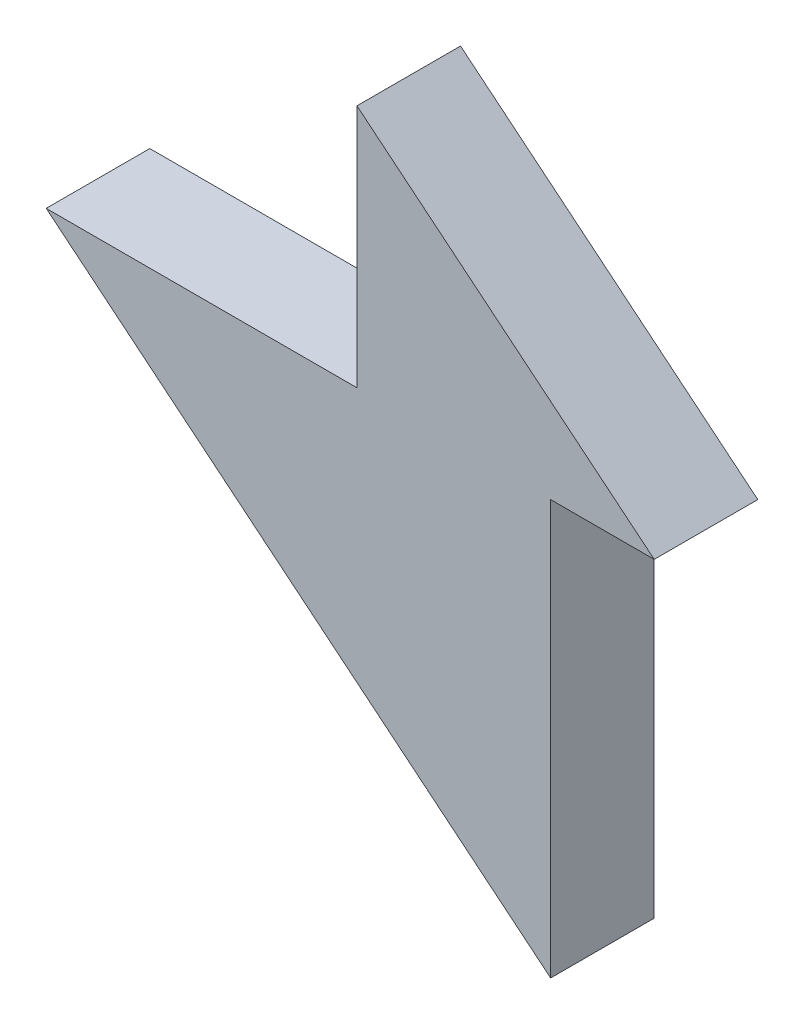
ISO-10303-21;
HEADER;
FILE_DESCRIPTION(('STEP AP214'),'2;1');
FILE_NAME('part.step','',(''),(''),'','','');
FILE_SCHEMA(('AUTOMOTIVE_DESIGN { 1 0 10303 214 1 1 1 1 }'));
ENDSEC;
DATA;
#1=APPLICATION_CONTEXT('core data for automotive mechanical design processes');
#2=APPLICATION_PROTOCOL_DEFINITION('international standard','automotive_design',2000,#1);
#3=PRODUCT_CONTEXT('',#1,'mechanical');
#4=PRODUCT('Part','Part','',(#3));
#5=PRODUCT_RELATED_PRODUCT_CATEGORY('part','',(#4));
#6=PRODUCT_DEFINITION_FORMATION('','',#4);
#7=PRODUCT_DEFINITION_CONTEXT('part definition',#1,'design');
#8=PRODUCT_DEFINITION('design','',#6,#7);
#9=PRODUCT_DEFINITION_SHAPE('','',#8);
#10=(LENGTH_UNIT() NAMED_UNIT(*) SI_UNIT(.MILLI.,.METRE.));
#11=(NAMED_UNIT(*) PLANE_ANGLE_UNIT() SI_UNIT($,.RADIAN.));
#12=(NAMED_UNIT(*) SI_UNIT($,.STERADIAN.) SOLID_ANGLE_UNIT());
#13=UNCERTAINTY_MEASURE_WITH_UNIT(LENGTH_MEASURE(1.E-05),#10,'distance_accuracy_value','');
#14=(GEOMETRIC_REPRESENTATION_CONTEXT(3) GLOBAL_UNCERTAINTY_ASSIGNED_CONTEXT((#13)) GLOBAL_UNIT_ASSIGNED_CONTEXT((#10,
#11,#12)) REPRESENTATION_CONTEXT('',''));
#15=CARTESIAN_POINT('',(0.,0.,0.));
#16=DIRECTION('',(0.,0.,1.));
#17=DIRECTION('',(1.,0.,0.));
#18=AXIS2_PLACEMENT_3D('',#15,#16,#17);
#19=CARTESIAN_POINT('',(0.,15.0000000000001,-6.35));
#20=DIRECTION('',(-1.,0.,0.));
#21=DIRECTION('',(0.,0.,1.));
#22=AXIS2_PLACEMENT_3D('',#19,#20,#21);
#23=PLANE('',#22);
#24=DIRECTION('',(0.,-1.,0.));
#25=VECTOR('',#24,1.);
#26=CARTESIAN_POINT('',(0.,15.0000000000001,0.));
#27=LINE('',#26,#25);
#28=CARTESIAN_POINT('',(0.,15.0000000000001,0.));
#29=VERTEX_POINT('',#28);
#30=CARTESIAN_POINT('',(0.,-10.3999999999999,0.));
#31=VERTEX_POINT('',#30);
#32=EDGE_CURVE('E129',#29,#31,#27,.T.);
#33=ORIENTED_EDGE('',*,*,#32,.T.);
#34=DIRECTION('',(0.,0.,1.));
#35=VECTOR('',#34,1.);
#36=CARTESIAN_POINT('',(0.,-10.3999999999999,-6.35));
#37=LINE('',#36,#35);
#38=CARTESIAN_POINT('',(0.,-10.3999999999999,-6.35));
#39=VERTEX_POINT('',#38);
#40=EDGE_CURVE('E11',#39,#31,#37,.T.);
#41=ORIENTED_EDGE('',*,*,#40,.F.);
#42=DIRECTION('',(0.,-1.,0.));
#43=VECTOR('',#42,1.);
#44=CARTESIAN_POINT('',(0.,15.0000000000001,-6.35));
#45=LINE('',#44,#43);
#46=CARTESIAN_POINT('',(0.,15.0000000000001,-6.35));
#47=VERTEX_POINT('',#46);
#48=EDGE_CURVE('E139',#47,#39,#45,.T.);
#49=ORIENTED_EDGE('',*,*,#48,.F.);
#50=DIRECTION('',(0.,0.,1.));
#51=VECTOR('',#50,1.);
#52=CARTESIAN_POINT('',(0.,15.0000000000001,-6.35));
#53=LINE('',#52,#51);
#54=EDGE_CURVE('E125',#47,#29,#53,.T.);
#55=ORIENTED_EDGE('',*,*,#54,.T.);
#56=EDGE_LOOP('',(#33,#41,#49,#55));
#57=FACE_BOUND('',#56,.T.);
#58=ADVANCED_FACE('F45',(#57),#23,.F.);
#59=CARTESIAN_POINT('',(0.,-10.3999999999999,-6.35));
#60=DIRECTION('',(0.63469945666799,0.772759082577072,0.));
#61=DIRECTION('',(-0.772759082577072,0.63469945666799,0.));
#62=AXIS2_PLACEMENT_3D('',#59,#60,#61);
#63=PLANE('',#62);
#64=DIRECTION('',(-0.772759082577072,0.63469945666799,0.));
#65=VECTOR('',#64,1.);
#66=CARTESIAN_POINT('',(0.,-10.3999999999999,0.));
#67=LINE('',#66,#65);
#68=CARTESIAN_POINT('',(-30.925,15.,0.));
#69=VERTEX_POINT('',#68);
#70=EDGE_CURVE('E132',#31,#69,#67,.T.);
#71=ORIENTED_EDGE('',*,*,#70,.T.);
#72=DIRECTION('',(0.,0.,1.));
#73=VECTOR('',#72,1.);
#74=CARTESIAN_POINT('',(-30.925,15.,-6.35));
#75=LINE('',#74,#73);
#76=CARTESIAN_POINT('',(-30.925,15.,-6.35));
#77=VERTEX_POINT('',#76);
#78=EDGE_CURVE('E53',#77,#69,#75,.T.);
#79=ORIENTED_EDGE('',*,*,#78,.F.);
#80=DIRECTION('',(-0.772759082577072,0.63469945666799,0.));
#81=VECTOR('',#80,1.);
#82=CARTESIAN_POINT('',(0.,-10.3999999999999,-6.35));
#83=LINE('',#82,#81);
#84=EDGE_CURVE('E98',#39,#77,#83,.T.);
#85=ORIENTED_EDGE('',*,*,#84,.F.);
#86=ORIENTED_EDGE('',*,*,#40,.T.);
#87=EDGE_LOOP('',(#71,#79,#85,#86));
#88=FACE_BOUND('',#87,.T.);
#89=ADVANCED_FACE('F163',(#88),#63,.F.);
#90=CARTESIAN_POINT('',(-30.925,15.,-6.35));
#91=DIRECTION('',(0.,-1.,0.));
#92=DIRECTION('',(0.,0.,-1.));
#93=AXIS2_PLACEMENT_3D('',#90,#91,#92);
#94=PLANE('',#93);
#95=DIRECTION('',(1.,0.,0.));
#96=VECTOR('',#95,1.);
#97=CARTESIAN_POINT('',(-30.925,15.,0.));
#98=LINE('',#97,#96);
#99=CARTESIAN_POINT('',(-11.875,15.,0.));
#100=VERTEX_POINT('',#99);
#101=EDGE_CURVE('E134',#69,#100,#98,.T.);
#102=ORIENTED_EDGE('',*,*,#101,.T.);
#103=DIRECTION('',(0.,0.,1.));
#104=VECTOR('',#103,1.);
#105=CARTESIAN_POINT('',(-11.875,15.,-6.35));
#106=LINE('',#105,#104);
#107=CARTESIAN_POINT('',(-11.875,15.,-6.35));
#108=VERTEX_POINT('',#107);
#109=EDGE_CURVE('E120',#108,#100,#106,.T.);
#110=ORIENTED_EDGE('',*,*,#109,.F.);
#111=DIRECTION('',(1.,0.,0.));
#112=VECTOR('',#111,1.);
#113=CARTESIAN_POINT('',(-30.925,15.,-6.35));
#114=LINE('',#113,#112);
#115=EDGE_CURVE('E111',#77,#108,#114,.T.);
#116=ORIENTED_EDGE('',*,*,#115,.F.);
#117=ORIENTED_EDGE('',*,*,#78,.T.);
#118=EDGE_LOOP('',(#102,#110,#116,#117));
#119=FACE_BOUND('',#118,.T.);
#120=ADVANCED_FACE('F145',(#119),#94,.F.);
#121=CARTESIAN_POINT('',(-11.875,15.,-6.35));
#122=DIRECTION('',(1.,0.,0.));
#123=DIRECTION('',(0.,0.,-1.));
#124=AXIS2_PLACEMENT_3D('',#121,#122,#123);
#125=PLANE('',#124);
#126=DIRECTION('',(0.,1.,0.));
#127=VECTOR('',#126,1.);
#128=CARTESIAN_POINT('',(-11.875,15.,0.));
#129=LINE('',#128,#127);
#130=CARTESIAN_POINT('',(-11.875,29.9689571544058,0.));
#131=VERTEX_POINT('',#130);
#132=EDGE_CURVE('E119',#100,#131,#129,.T.);
#133=ORIENTED_EDGE('',*,*,#132,.T.);
#134=DIRECTION('',(0.,0.,1.));
#135=VECTOR('',#134,1.);
#136=CARTESIAN_POINT('',(-11.875,29.9689571544058,-6.35));
#137=LINE('',#136,#135);
#138=CARTESIAN_POINT('',(-11.875,29.9689571544058,-6.35));
#139=VERTEX_POINT('',#138);
#140=EDGE_CURVE('E116',#139,#131,#137,.T.);
#141=ORIENTED_EDGE('',*,*,#140,.F.);
#142=DIRECTION('',(0.,1.,0.));
#143=VECTOR('',#142,1.);
#144=CARTESIAN_POINT('',(-11.875,15.,-6.35));
#145=LINE('',#144,#143);
#146=EDGE_CURVE('E105',#108,#139,#145,.T.);
#147=ORIENTED_EDGE('',*,*,#146,.F.);
#148=ORIENTED_EDGE('',*,*,#109,.T.);
#149=EDGE_LOOP('',(#133,#141,#147,#148));
#150=FACE_BOUND('',#149,.T.);
#151=ADVANCED_FACE('F117',(#150),#125,.F.);
#152=CARTESIAN_POINT('',(-11.875,29.9689571544058,-6.35));
#153=DIRECTION('',(-0.63469945666799,-0.772759082577072,0.));
#154=DIRECTION('',(0.772759082577072,-0.63469945666799,0.));
#155=AXIS2_PLACEMENT_3D('',#152,#153,#154);
#156=PLANE('',#155);
#157=DIRECTION('',(0.772759082577072,-0.63469945666799,0.));
#158=VECTOR('',#157,1.);
#159=CARTESIAN_POINT('',(-11.875,29.9689571544058,0.));
#160=LINE('',#159,#158);
#161=CARTESIAN_POINT('',(6.35,15.0000000000001,0.));
#162=VERTEX_POINT('',#161);
#163=EDGE_CURVE('E84',#131,#162,#160,.T.);
#164=ORIENTED_EDGE('',*,*,#163,.T.);
#165=DIRECTION('',(0.,0.,1.));
#166=VECTOR('',#165,1.);
#167=CARTESIAN_POINT('',(6.35,15.0000000000001,-6.35));
#168=LINE('',#167,#166);
#169=CARTESIAN_POINT('',(6.35,15.0000000000001,-6.35));
#170=VERTEX_POINT('',#169);
#171=EDGE_CURVE('E121',#170,#162,#168,.T.);
#172=ORIENTED_EDGE('',*,*,#171,.F.);
#173=DIRECTION('',(0.772759082577072,-0.63469945666799,0.));
#174=VECTOR('',#173,1.);
#175=CARTESIAN_POINT('',(-11.875,29.9689571544058,-6.35));
#176=LINE('',#175,#174);
#177=EDGE_CURVE('E109',#139,#170,#176,.T.);
#178=ORIENTED_EDGE('',*,*,#177,.F.);
#179=ORIENTED_EDGE('',*,*,#140,.T.);
#180=EDGE_LOOP('',(#164,#172,#178,#179));
#181=FACE_BOUND('',#180,.T.);
#182=ADVANCED_FACE('F123',(#181),#156,.F.);
#183=CARTESIAN_POINT('',(6.35,15.0000000000001,-6.35));
#184=DIRECTION('',(0.,1.,0.));
#185=DIRECTION('',(0.,0.,1.));
#186=AXIS2_PLACEMENT_3D('',#183,#184,#185);
#187=PLANE('',#186);
#188=DIRECTION('',(-1.,0.,0.));
#189=VECTOR('',#188,1.);
#190=CARTESIAN_POINT('',(6.35,15.0000000000001,0.));
#191=LINE('',#190,#189);
#192=EDGE_CURVE('E90',#162,#29,#191,.T.);
#193=ORIENTED_EDGE('',*,*,#192,.T.);
#194=ORIENTED_EDGE('',*,*,#54,.F.);
#195=DIRECTION('',(-1.,0.,0.));
#196=VECTOR('',#195,1.);
#197=CARTESIAN_POINT('',(6.35,15.0000000000001,-6.35));
#198=LINE('',#197,#196);
#199=EDGE_CURVE('E61',#170,#47,#198,.T.);
#200=ORIENTED_EDGE('',*,*,#199,.F.);
#201=ORIENTED_EDGE('',*,*,#171,.T.);
#202=EDGE_LOOP('',(#193,#194,#200,#201));
#203=FACE_BOUND('',#202,.T.);
#204=ADVANCED_FACE('F152',(#203),#187,.F.);
#205=CARTESIAN_POINT('',(0.,0.,-6.35));
#206=DIRECTION('',(0.,0.,1.));
#207=DIRECTION('',(1.,0.,0.));
#208=AXIS2_PLACEMENT_3D('',#205,#206,#207);
#209=PLANE('',#208);
#210=ORIENTED_EDGE('',*,*,#48,.T.);
#211=ORIENTED_EDGE('',*,*,#84,.T.);
#212=ORIENTED_EDGE('',*,*,#115,.T.);
#213=ORIENTED_EDGE('',*,*,#146,.T.);
#214=ORIENTED_EDGE('',*,*,#177,.T.);
#215=ORIENTED_EDGE('',*,*,#199,.T.);
#216=EDGE_LOOP('',(#210,#211,#212,#213,#214,#215));
#217=FACE_BOUND('',#216,.T.);
#218=ADVANCED_FACE('F107',(#217),#209,.F.);
#219=CARTESIAN_POINT('',(0.,0.,0.));
#220=DIRECTION('',(0.,0.,1.));
#221=DIRECTION('',(1.,0.,0.));
#222=AXIS2_PLACEMENT_3D('',#219,#220,#221);
#223=PLANE('',#222);
#224=ORIENTED_EDGE('',*,*,#32,.F.);
#225=ORIENTED_EDGE('',*,*,#192,.F.);
#226=ORIENTED_EDGE('',*,*,#163,.F.);
#227=ORIENTED_EDGE('',*,*,#132,.F.);
#228=ORIENTED_EDGE('',*,*,#101,.F.);
#229=ORIENTED_EDGE('',*,*,#70,.F.);
#230=EDGE_LOOP('',(#224,#225,#226,#227,#228,#229));
#231=FACE_BOUND('',#230,.T.);
#232=ADVANCED_FACE('F148',(#231),#223,.T.);
#233=CLOSED_SHELL('',(#58,#89,#120,#151,#182,#204,#218,#232));
#234=MANIFOLD_SOLID_BREP('B2',#233);
#235=ADVANCED_BREP_SHAPE_REPRESENTATION('',(#18,#234),#14);
#236=SHAPE_DEFINITION_REPRESENTATION(#9,#235);
ENDSEC;
END-ISO-10303-21;
